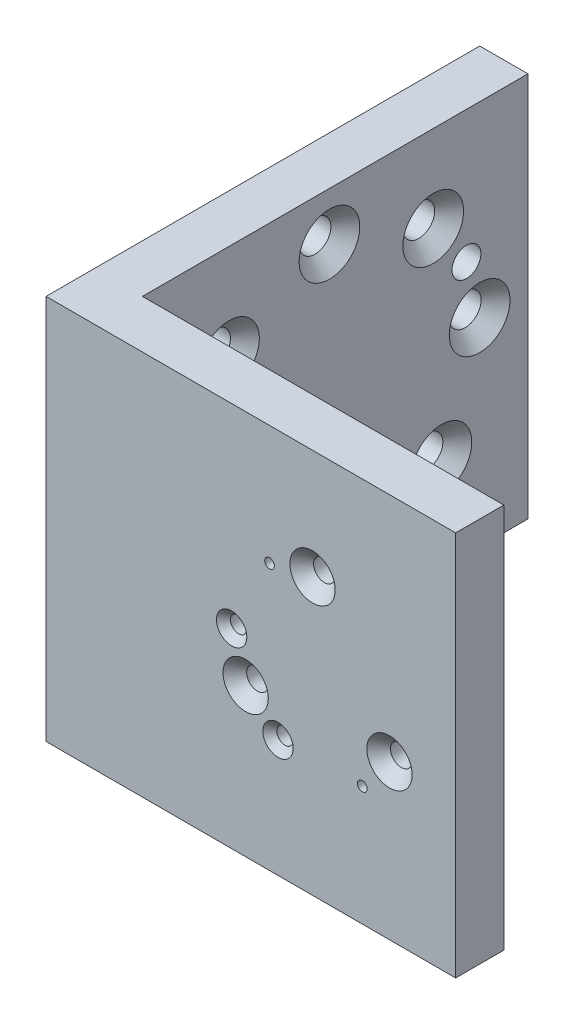
ISO-10303-21;
HEADER;
FILE_DESCRIPTION(('STEP AP214'),'2;1');
FILE_NAME('part.step','',(''),(''),'','','');
FILE_SCHEMA(('AUTOMOTIVE_DESIGN { 1 0 10303 214 1 1 1 1 }'));
ENDSEC;
DATA;
#1=APPLICATION_CONTEXT('core data for automotive mechanical design processes');
#2=APPLICATION_PROTOCOL_DEFINITION('international standard','automotive_design',2000,#1);
#3=PRODUCT_CONTEXT('',#1,'mechanical');
#4=PRODUCT('Part','Part','',(#3));
#5=PRODUCT_RELATED_PRODUCT_CATEGORY('part','',(#4));
#6=PRODUCT_DEFINITION_FORMATION('','',#4);
#7=PRODUCT_DEFINITION_CONTEXT('part definition',#1,'design');
#8=PRODUCT_DEFINITION('design','',#6,#7);
#9=PRODUCT_DEFINITION_SHAPE('','',#8);
#10=(LENGTH_UNIT() NAMED_UNIT(*) SI_UNIT(.MILLI.,.METRE.));
#11=(NAMED_UNIT(*) PLANE_ANGLE_UNIT() SI_UNIT($,.RADIAN.));
#12=(NAMED_UNIT(*) SI_UNIT($,.STERADIAN.) SOLID_ANGLE_UNIT());
#13=UNCERTAINTY_MEASURE_WITH_UNIT(LENGTH_MEASURE(1.E-05),#10,'distance_accuracy_value','');
#14=(GEOMETRIC_REPRESENTATION_CONTEXT(3) GLOBAL_UNCERTAINTY_ASSIGNED_CONTEXT((#13)) GLOBAL_UNIT_ASSIGNED_CONTEXT((#10,
#11,#12)) REPRESENTATION_CONTEXT('',''));
#15=CARTESIAN_POINT('',(0.,0.,0.));
#16=DIRECTION('',(0.,0.,1.));
#17=DIRECTION('',(1.,0.,0.));
#18=AXIS2_PLACEMENT_3D('',#15,#16,#17);
#19=CARTESIAN_POINT('',(0.,80.,90.));
#20=DIRECTION('',(-1.,0.,0.));
#21=DIRECTION('',(0.,0.,1.));
#22=AXIS2_PLACEMENT_3D('',#19,#20,#21);
#23=PLANE('',#22);
#24=CARTESIAN_POINT('',(0.,52.5731082601496,12.7618475538711));
#25=DIRECTION('',(-1.,0.,0.));
#26=DIRECTION('',(0.,0.,1.));
#27=AXIS2_PLACEMENT_3D('',#24,#25,#26);
#28=CIRCLE('',#27,3.0000000000041);
#29=CARTESIAN_POINT('',(0.,52.5731082601496,15.7618475538752));
#30=VERTEX_POINT('',#29);
#31=EDGE_CURVE('E153',#30,#30,#28,.T.);
#32=ORIENTED_EDGE('',*,*,#31,.F.);
#33=EDGE_LOOP('',(#32));
#34=FACE_BOUND('',#33,.T.);
#35=CARTESIAN_POINT('',(0.,27.4268917398504,67.2381524461289));
#36=DIRECTION('',(-1.,0.,0.));
#37=DIRECTION('',(0.,0.,1.));
#38=AXIS2_PLACEMENT_3D('',#35,#36,#37);
#39=CIRCLE('',#38,3.00000000000409);
#40=CARTESIAN_POINT('',(0.,27.4268917398504,70.238152446133));
#41=VERTEX_POINT('',#40);
#42=EDGE_CURVE('E152',#41,#41,#39,.T.);
#43=ORIENTED_EDGE('',*,*,#42,.F.);
#44=EDGE_LOOP('',(#43));
#45=FACE_BOUND('',#44,.T.);
#46=CARTESIAN_POINT('',(0.,10.0237082271074,38.8075522877674));
#47=DIRECTION('',(1.,0.,0.));
#48=DIRECTION('',(0.,0.,-1.));
#49=AXIS2_PLACEMENT_3D('',#46,#47,#48);
#50=CIRCLE('',#49,3.29999999999999);
#51=CARTESIAN_POINT('',(0.,10.0237082271074,35.5075522877674));
#52=VERTEX_POINT('',#51);
#53=EDGE_CURVE('E294',#52,#52,#50,.T.);
#54=ORIENTED_EDGE('',*,*,#53,.T.);
#55=EDGE_LOOP('',(#54));
#56=FACE_BOUND('',#55,.T.);
#57=CARTESIAN_POINT('',(0.,17.9603729490309,60.3532513239087));
#58=DIRECTION('',(1.,0.,0.));
#59=DIRECTION('',(0.,0.,-1.));
#60=AXIS2_PLACEMENT_3D('',#57,#58,#59);
#61=CIRCLE('',#60,3.29999999999999);
#62=CARTESIAN_POINT('',(0.,17.9603729490309,57.0532513239087));
#63=VERTEX_POINT('',#62);
#64=EDGE_CURVE('E297',#63,#63,#61,.T.);
#65=ORIENTED_EDGE('',*,*,#64,.T.);
#66=EDGE_LOOP('',(#65));
#67=FACE_BOUND('',#66,.T.);
#68=CARTESIAN_POINT('',(0.,38.8075522877674,69.9762917728927));
#69=DIRECTION('',(1.,0.,0.));
#70=DIRECTION('',(0.,0.,-1.));
#71=AXIS2_PLACEMENT_3D('',#68,#69,#70);
#72=CIRCLE('',#71,3.29999999999998);
#73=CARTESIAN_POINT('',(0.,38.8075522877674,66.6762917728927));
#74=VERTEX_POINT('',#73);
#75=EDGE_CURVE('E300',#74,#74,#72,.T.);
#76=ORIENTED_EDGE('',*,*,#75,.T.);
#77=EDGE_LOOP('',(#76));
#78=FACE_BOUND('',#77,.T.);
#79=CARTESIAN_POINT('',(0.,60.353251323909,62.0396270509689));
#80=DIRECTION('',(1.,0.,0.));
#81=DIRECTION('',(0.,0.,-1.));
#82=AXIS2_PLACEMENT_3D('',#79,#80,#81);
#83=CIRCLE('',#82,3.29999999999999);
#84=CARTESIAN_POINT('',(0.,60.353251323909,58.7396270509689));
#85=VERTEX_POINT('',#84);
#86=EDGE_CURVE('E303',#85,#85,#83,.T.);
#87=ORIENTED_EDGE('',*,*,#86,.T.);
#88=EDGE_LOOP('',(#87));
#89=FACE_BOUND('',#88,.T.);
#90=CARTESIAN_POINT('',(0.,69.9762917728927,41.1924477122326));
#91=DIRECTION('',(1.,0.,0.));
#92=DIRECTION('',(0.,0.,-1.));
#93=AXIS2_PLACEMENT_3D('',#90,#91,#92);
#94=CIRCLE('',#93,3.29999999999998);
#95=CARTESIAN_POINT('',(0.,69.9762917728927,37.8924477122326));
#96=VERTEX_POINT('',#95);
#97=EDGE_CURVE('E306',#96,#96,#94,.T.);
#98=ORIENTED_EDGE('',*,*,#97,.T.);
#99=EDGE_LOOP('',(#98));
#100=FACE_BOUND('',#99,.T.);
#101=DIRECTION('',(0.,0.,-1.));
#102=VECTOR('',#101,1.);
#103=CARTESIAN_POINT('',(0.,0.,90.));
#104=LINE('',#103,#102);
#105=CARTESIAN_POINT('',(0.,0.,90.));
#106=VERTEX_POINT('',#105);
#107=CARTESIAN_POINT('',(0.,0.,0.));
#108=VERTEX_POINT('',#107);
#109=EDGE_CURVE('E126',#106,#108,#104,.T.);
#110=ORIENTED_EDGE('',*,*,#109,.F.);
#111=DIRECTION('',(0.,-1.,0.));
#112=VECTOR('',#111,1.);
#113=CARTESIAN_POINT('',(0.,80.,90.));
#114=LINE('',#113,#112);
#115=CARTESIAN_POINT('',(0.,80.,90.));
#116=VERTEX_POINT('',#115);
#117=EDGE_CURVE('E60',#116,#106,#114,.T.);
#118=ORIENTED_EDGE('',*,*,#117,.F.);
#119=DIRECTION('',(0.,0.,-1.));
#120=VECTOR('',#119,1.);
#121=CARTESIAN_POINT('',(0.,80.,90.));
#122=LINE('',#121,#120);
#123=CARTESIAN_POINT('',(0.,80.,0.));
#124=VERTEX_POINT('',#123);
#125=EDGE_CURVE('E128',#116,#124,#122,.T.);
#126=ORIENTED_EDGE('',*,*,#125,.T.);
#127=DIRECTION('',(0.,-1.,0.));
#128=VECTOR('',#127,1.);
#129=CARTESIAN_POINT('',(0.,80.,0.));
#130=LINE('',#129,#128);
#131=EDGE_CURVE('E81',#124,#108,#130,.T.);
#132=ORIENTED_EDGE('',*,*,#131,.T.);
#133=EDGE_LOOP('',(#110,#118,#126,#132));
#134=FACE_BOUND('',#133,.T.);
#135=CARTESIAN_POINT('',(0.,19.6467486760911,17.9603729490311));
#136=DIRECTION('',(1.,0.,0.));
#137=DIRECTION('',(0.,0.,-1.));
#138=AXIS2_PLACEMENT_3D('',#135,#136,#137);
#139=CIRCLE('',#138,3.29999999999999);
#140=CARTESIAN_POINT('',(0.,19.6467486760911,14.6603729490311));
#141=VERTEX_POINT('',#140);
#142=EDGE_CURVE('E120',#141,#141,#139,.T.);
#143=ORIENTED_EDGE('',*,*,#142,.T.);
#144=EDGE_LOOP('',(#143));
#145=FACE_BOUND('',#144,.T.);
#146=CARTESIAN_POINT('',(0.,41.1924477122326,10.0237082271074));
#147=DIRECTION('',(1.,0.,0.));
#148=DIRECTION('',(0.,0.,-1.));
#149=AXIS2_PLACEMENT_3D('',#146,#147,#148);
#150=CIRCLE('',#149,3.29999999999998);
#151=CARTESIAN_POINT('',(0.,41.1924477122326,6.72370822710742));
#152=VERTEX_POINT('',#151);
#153=EDGE_CURVE('E311',#152,#152,#150,.T.);
#154=ORIENTED_EDGE('',*,*,#153,.T.);
#155=EDGE_LOOP('',(#154));
#156=FACE_BOUND('',#155,.T.);
#157=CARTESIAN_POINT('',(0.,62.0396270509691,19.6467486760913));
#158=DIRECTION('',(1.,0.,0.));
#159=DIRECTION('',(0.,0.,-1.));
#160=AXIS2_PLACEMENT_3D('',#157,#158,#159);
#161=CIRCLE('',#160,3.29999999999999);
#162=CARTESIAN_POINT('',(0.,62.0396270509691,16.3467486760913));
#163=VERTEX_POINT('',#162);
#164=EDGE_CURVE('E309',#163,#163,#161,.T.);
#165=ORIENTED_EDGE('',*,*,#164,.T.);
#166=EDGE_LOOP('',(#165));
#167=FACE_BOUND('',#166,.T.);
#168=ADVANCED_FACE('F36',(#34,#45,#56,#67,#78,#89,#100,#134,#145,#156,#167),#23,.T.);
#169=CARTESIAN_POINT('',(10.,0.,0.));
#170=DIRECTION('',(-1.,0.,0.));
#171=DIRECTION('',(0.,0.,1.));
#172=AXIS2_PLACEMENT_3D('',#169,#170,#171);
#173=PLANE('',#172);
#174=CARTESIAN_POINT('',(10.,19.6467486760911,17.9603729490311));
#175=DIRECTION('',(-1.,0.,0.));
#176=DIRECTION('',(0.,0.,1.));
#177=AXIS2_PLACEMENT_3D('',#174,#175,#176);
#178=CIRCLE('',#177,6.29999999998704);
#179=CARTESIAN_POINT('',(10.,19.6467486760911,24.2603729490181));
#180=VERTEX_POINT('',#179);
#181=EDGE_CURVE('E193',#180,#180,#178,.T.);
#182=ORIENTED_EDGE('',*,*,#181,.T.);
#183=EDGE_LOOP('',(#182));
#184=FACE_BOUND('',#183,.T.);
#185=CARTESIAN_POINT('',(10.,17.9603729490309,60.3532513239087));
#186=DIRECTION('',(-1.,0.,0.));
#187=DIRECTION('',(0.,0.,1.));
#188=AXIS2_PLACEMENT_3D('',#185,#186,#187);
#189=CIRCLE('',#188,6.29999999998704);
#190=CARTESIAN_POINT('',(10.,17.9603729490309,66.6532513238957));
#191=VERTEX_POINT('',#190);
#192=EDGE_CURVE('E190',#191,#191,#189,.T.);
#193=ORIENTED_EDGE('',*,*,#192,.T.);
#194=EDGE_LOOP('',(#193));
#195=FACE_BOUND('',#194,.T.);
#196=CARTESIAN_POINT('',(10.,10.0237082271074,38.8075522877674));
#197=DIRECTION('',(-1.,0.,0.));
#198=DIRECTION('',(0.,0.,1.));
#199=AXIS2_PLACEMENT_3D('',#196,#197,#198);
#200=CIRCLE('',#199,6.299999999987);
#201=CARTESIAN_POINT('',(10.,10.0237082271074,45.1075522877544));
#202=VERTEX_POINT('',#201);
#203=EDGE_CURVE('E187',#202,#202,#200,.T.);
#204=ORIENTED_EDGE('',*,*,#203,.T.);
#205=EDGE_LOOP('',(#204));
#206=FACE_BOUND('',#205,.T.);
#207=CARTESIAN_POINT('',(10.,38.8075522877674,69.9762917728927));
#208=DIRECTION('',(-1.,0.,0.));
#209=DIRECTION('',(0.,0.,1.));
#210=AXIS2_PLACEMENT_3D('',#207,#208,#209);
#211=CIRCLE('',#210,6.29999999998704);
#212=CARTESIAN_POINT('',(10.,38.8075522877674,76.2762917728797));
#213=VERTEX_POINT('',#212);
#214=EDGE_CURVE('E184',#213,#213,#211,.T.);
#215=ORIENTED_EDGE('',*,*,#214,.T.);
#216=EDGE_LOOP('',(#215));
#217=FACE_BOUND('',#216,.T.);
#218=CARTESIAN_POINT('',(10.,60.353251323909,62.0396270509689));
#219=DIRECTION('',(-1.,0.,0.));
#220=DIRECTION('',(0.,0.,1.));
#221=AXIS2_PLACEMENT_3D('',#218,#219,#220);
#222=CIRCLE('',#221,6.29999999998703);
#223=CARTESIAN_POINT('',(10.,60.353251323909,68.3396270509559));
#224=VERTEX_POINT('',#223);
#225=EDGE_CURVE('E181',#224,#224,#222,.T.);
#226=ORIENTED_EDGE('',*,*,#225,.T.);
#227=EDGE_LOOP('',(#226));
#228=FACE_BOUND('',#227,.T.);
#229=CARTESIAN_POINT('',(10.,69.9762917728927,41.1924477122326));
#230=DIRECTION('',(-1.,0.,0.));
#231=DIRECTION('',(0.,0.,1.));
#232=AXIS2_PLACEMENT_3D('',#229,#230,#231);
#233=CIRCLE('',#232,6.29999999998704);
#234=CARTESIAN_POINT('',(10.,69.9762917728927,47.4924477122196));
#235=VERTEX_POINT('',#234);
#236=EDGE_CURVE('E178',#235,#235,#233,.T.);
#237=ORIENTED_EDGE('',*,*,#236,.T.);
#238=EDGE_LOOP('',(#237));
#239=FACE_BOUND('',#238,.T.);
#240=CARTESIAN_POINT('',(10.,62.0396270509691,19.6467486760913));
#241=DIRECTION('',(-1.,0.,0.));
#242=DIRECTION('',(0.,0.,1.));
#243=AXIS2_PLACEMENT_3D('',#240,#241,#242);
#244=CIRCLE('',#243,6.299999999987);
#245=CARTESIAN_POINT('',(10.,62.0396270509691,25.9467486760783));
#246=VERTEX_POINT('',#245);
#247=EDGE_CURVE('E175',#246,#246,#244,.T.);
#248=ORIENTED_EDGE('',*,*,#247,.T.);
#249=EDGE_LOOP('',(#248));
#250=FACE_BOUND('',#249,.T.);
#251=CARTESIAN_POINT('',(10.,41.1924477122326,10.0237082271074));
#252=DIRECTION('',(-1.,0.,0.));
#253=DIRECTION('',(0.,0.,1.));
#254=AXIS2_PLACEMENT_3D('',#251,#252,#253);
#255=CIRCLE('',#254,6.29999999998704);
#256=CARTESIAN_POINT('',(10.,41.1924477122326,16.3237082270944));
#257=VERTEX_POINT('',#256);
#258=EDGE_CURVE('E172',#257,#257,#255,.T.);
#259=ORIENTED_EDGE('',*,*,#258,.T.);
#260=EDGE_LOOP('',(#259));
#261=FACE_BOUND('',#260,.T.);
#262=CARTESIAN_POINT('',(10.,52.5731082601496,12.7618475538711));
#263=DIRECTION('',(-1.,0.,0.));
#264=DIRECTION('',(0.,0.,1.));
#265=AXIS2_PLACEMENT_3D('',#262,#263,#264);
#266=CIRCLE('',#265,3.00000000000409);
#267=CARTESIAN_POINT('',(10.,52.5731082601496,15.7618475538752));
#268=VERTEX_POINT('',#267);
#269=EDGE_CURVE('E149',#268,#268,#266,.T.);
#270=ORIENTED_EDGE('',*,*,#269,.T.);
#271=EDGE_LOOP('',(#270));
#272=FACE_BOUND('',#271,.T.);
#273=CARTESIAN_POINT('',(10.,27.4268917398504,67.2381524461289));
#274=DIRECTION('',(-1.,0.,0.));
#275=DIRECTION('',(0.,0.,1.));
#276=AXIS2_PLACEMENT_3D('',#273,#274,#275);
#277=CIRCLE('',#276,3.00000000000409);
#278=CARTESIAN_POINT('',(10.,27.4268917398504,70.238152446133));
#279=VERTEX_POINT('',#278);
#280=EDGE_CURVE('E291',#279,#279,#277,.T.);
#281=ORIENTED_EDGE('',*,*,#280,.T.);
#282=EDGE_LOOP('',(#281));
#283=FACE_BOUND('',#282,.T.);
#284=DIRECTION('',(0.,0.,1.));
#285=VECTOR('',#284,1.);
#286=CARTESIAN_POINT('',(10.,80.,0.));
#287=LINE('',#286,#285);
#288=CARTESIAN_POINT('',(10.,80.,0.));
#289=VERTEX_POINT('',#288);
#290=CARTESIAN_POINT('',(10.,80.,80.));
#291=VERTEX_POINT('',#290);
#292=EDGE_CURVE('E104',#289,#291,#287,.T.);
#293=ORIENTED_EDGE('',*,*,#292,.T.);
#294=DIRECTION('',(0.,1.,0.));
#295=VECTOR('',#294,1.);
#296=CARTESIAN_POINT('',(10.,0.,80.));
#297=LINE('',#296,#295);
#298=CARTESIAN_POINT('',(10.,0.,80.));
#299=VERTEX_POINT('',#298);
#300=EDGE_CURVE('E98',#299,#291,#297,.T.);
#301=ORIENTED_EDGE('',*,*,#300,.F.);
#302=DIRECTION('',(0.,0.,1.));
#303=VECTOR('',#302,1.);
#304=CARTESIAN_POINT('',(10.,0.,0.));
#305=LINE('',#304,#303);
#306=CARTESIAN_POINT('',(10.,0.,0.));
#307=VERTEX_POINT('',#306);
#308=EDGE_CURVE('E101',#307,#299,#305,.T.);
#309=ORIENTED_EDGE('',*,*,#308,.F.);
#310=DIRECTION('',(0.,1.,0.));
#311=VECTOR('',#310,1.);
#312=CARTESIAN_POINT('',(10.,0.,0.));
#313=LINE('',#312,#311);
#314=EDGE_CURVE('E124',#307,#289,#313,.T.);
#315=ORIENTED_EDGE('',*,*,#314,.T.);
#316=EDGE_LOOP('',(#293,#301,#309,#315));
#317=FACE_BOUND('',#316,.T.);
#318=ADVANCED_FACE('F99',(#184,#195,#206,#217,#228,#239,#250,#261,#272,#283,#317),#173,.F.);
#319=CARTESIAN_POINT('',(85.,80.,90.));
#320=DIRECTION('',(0.,0.,1.));
#321=DIRECTION('',(1.,0.,0.));
#322=AXIS2_PLACEMENT_3D('',#319,#320,#321);
#323=PLANE('',#322);
#324=CARTESIAN_POINT('',(38.512017179999,39.5871357519102,90.));
#325=DIRECTION('',(0.,0.,1.));
#326=DIRECTION('',(1.,0.,0.));
#327=AXIS2_PLACEMENT_3D('',#324,#325,#326);
#328=CIRCLE('',#327,3.15000000003422);
#329=CARTESIAN_POINT('',(41.6620171800332,39.5871357519102,90.));
#330=VERTEX_POINT('',#329);
#331=EDGE_CURVE('E44',#330,#330,#328,.F.);
#332=ORIENTED_EDGE('',*,*,#331,.T.);
#333=EDGE_LOOP('',(#332));
#334=FACE_BOUND('',#333,.T.);
#335=CARTESIAN_POINT('',(48.1346530094905,24.3751378656039,90.));
#336=DIRECTION('',(0.,0.,1.));
#337=DIRECTION('',(1.,0.,0.));
#338=AXIS2_PLACEMENT_3D('',#335,#336,#337);
#339=CIRCLE('',#338,3.15000000003423);
#340=CARTESIAN_POINT('',(51.2846530095247,24.3751378656039,90.));
#341=VERTEX_POINT('',#340);
#342=EDGE_CURVE('E238',#341,#341,#339,.F.);
#343=ORIENTED_EDGE('',*,*,#342,.T.);
#344=EDGE_LOOP('',(#343));
#345=FACE_BOUND('',#344,.T.);
#346=CARTESIAN_POINT('',(41.4218353589565,30.7783073300706,90.));
#347=DIRECTION('',(0.,0.,1.));
#348=DIRECTION('',(1.,0.,0.));
#349=AXIS2_PLACEMENT_3D('',#346,#347,#348);
#350=CIRCLE('',#349,4.70000000007102);
#351=CARTESIAN_POINT('',(46.1218353590275,30.7783073300706,90.));
#352=VERTEX_POINT('',#351);
#353=EDGE_CURVE('E226',#352,#352,#350,.F.);
#354=ORIENTED_EDGE('',*,*,#353,.T.);
#355=EDGE_LOOP('',(#354));
#356=FACE_BOUND('',#355,.T.);
#357=CARTESIAN_POINT('',(71.2753024385736,31.9857854152686,90.));
#358=DIRECTION('',(0.,0.,1.));
#359=DIRECTION('',(1.,0.,0.));
#360=AXIS2_PLACEMENT_3D('',#357,#358,#359);
#361=CIRCLE('',#360,4.70000000007098);
#362=CARTESIAN_POINT('',(75.9753024386446,31.9857854152686,90.));
#363=VERTEX_POINT('',#362);
#364=EDGE_CURVE('E223',#363,#363,#361,.F.);
#365=ORIENTED_EDGE('',*,*,#364,.T.);
#366=EDGE_LOOP('',(#365));
#367=FACE_BOUND('',#366,.T.);
#368=CARTESIAN_POINT('',(55.3028622024699,57.2359072546608,90.));
#369=DIRECTION('',(0.,0.,1.));
#370=DIRECTION('',(1.,0.,0.));
#371=AXIS2_PLACEMENT_3D('',#368,#369,#370);
#372=CIRCLE('',#371,4.70000000007102);
#373=CARTESIAN_POINT('',(60.0028622025409,57.2359072546608,90.));
#374=VERTEX_POINT('',#373);
#375=EDGE_CURVE('E220',#374,#374,#372,.F.);
#376=ORIENTED_EDGE('',*,*,#375,.T.);
#377=EDGE_LOOP('',(#376));
#378=FACE_BOUND('',#377,.T.);
#379=CARTESIAN_POINT('',(46.3773641705084,55.2119978863063,90.));
#380=DIRECTION('',(0.,0.,-1.));
#381=DIRECTION('',(-1.,0.,0.));
#382=AXIS2_PLACEMENT_3D('',#379,#380,#381);
#383=CIRCLE('',#382,0.999999999999987);
#384=CARTESIAN_POINT('',(45.3773641705084,55.2119978863063,90.));
#385=VERTEX_POINT('',#384);
#386=EDGE_CURVE('E279',#385,#385,#383,.T.);
#387=ORIENTED_EDGE('',*,*,#386,.T.);
#388=EDGE_LOOP('',(#387));
#389=FACE_BOUND('',#388,.T.);
#390=CARTESIAN_POINT('',(65.6226358294915,24.7880021136938,90.));
#391=DIRECTION('',(0.,0.,-1.));
#392=DIRECTION('',(-1.,0.,0.));
#393=AXIS2_PLACEMENT_3D('',#390,#391,#392);
#394=CIRCLE('',#393,0.999999999999987);
#395=CARTESIAN_POINT('',(64.6226358294915,24.7880021136938,90.));
#396=VERTEX_POINT('',#395);
#397=EDGE_CURVE('E278',#396,#396,#394,.T.);
#398=ORIENTED_EDGE('',*,*,#397,.T.);
#399=EDGE_LOOP('',(#398));
#400=FACE_BOUND('',#399,.T.);
#401=DIRECTION('',(-1.,0.,0.));
#402=VECTOR('',#401,1.);
#403=CARTESIAN_POINT('',(85.,0.,90.));
#404=LINE('',#403,#402);
#405=CARTESIAN_POINT('',(85.,0.,90.));
#406=VERTEX_POINT('',#405);
#407=EDGE_CURVE('E131',#406,#106,#404,.T.);
#408=ORIENTED_EDGE('',*,*,#407,.F.);
#409=DIRECTION('',(0.,-1.,0.));
#410=VECTOR('',#409,1.);
#411=CARTESIAN_POINT('',(85.,80.,90.));
#412=LINE('',#411,#410);
#413=CARTESIAN_POINT('',(85.,80.,90.));
#414=VERTEX_POINT('',#413);
#415=EDGE_CURVE('E145',#414,#406,#412,.T.);
#416=ORIENTED_EDGE('',*,*,#415,.F.);
#417=DIRECTION('',(-1.,0.,0.));
#418=VECTOR('',#417,1.);
#419=CARTESIAN_POINT('',(85.,80.,90.));
#420=LINE('',#419,#418);
#421=EDGE_CURVE('E135',#414,#116,#420,.T.);
#422=ORIENTED_EDGE('',*,*,#421,.T.);
#423=ORIENTED_EDGE('',*,*,#117,.T.);
#424=EDGE_LOOP('',(#408,#416,#422,#423));
#425=FACE_BOUND('',#424,.T.);
#426=ADVANCED_FACE('F243',(#334,#345,#356,#367,#378,#389,#400,#425),#323,.T.);
#427=CARTESIAN_POINT('',(85.,80.,0.));
#428=DIRECTION('',(1.,0.,0.));
#429=DIRECTION('',(0.,0.,-1.));
#430=AXIS2_PLACEMENT_3D('',#427,#428,#429);
#431=PLANE('',#430);
#432=DIRECTION('',(0.,1.,0.));
#433=VECTOR('',#432,1.);
#434=CARTESIAN_POINT('',(85.,0.,80.));
#435=LINE('',#434,#433);
#436=CARTESIAN_POINT('',(85.,0.,80.));
#437=VERTEX_POINT('',#436);
#438=CARTESIAN_POINT('',(85.,80.,80.));
#439=VERTEX_POINT('',#438);
#440=EDGE_CURVE('E51',#437,#439,#435,.T.);
#441=ORIENTED_EDGE('',*,*,#440,.T.);
#442=DIRECTION('',(0.,0.,1.));
#443=VECTOR('',#442,1.);
#444=CARTESIAN_POINT('',(85.,80.,0.));
#445=LINE('',#444,#443);
#446=EDGE_CURVE('E133',#439,#414,#445,.T.);
#447=ORIENTED_EDGE('',*,*,#446,.T.);
#448=ORIENTED_EDGE('',*,*,#415,.T.);
#449=DIRECTION('',(0.,0.,1.));
#450=VECTOR('',#449,1.);
#451=CARTESIAN_POINT('',(85.,0.,0.));
#452=LINE('',#451,#450);
#453=EDGE_CURVE('E139',#437,#406,#452,.T.);
#454=ORIENTED_EDGE('',*,*,#453,.F.);
#455=EDGE_LOOP('',(#441,#447,#448,#454));
#456=FACE_BOUND('',#455,.T.);
#457=ADVANCED_FACE('F558',(#456),#431,.T.);
#458=CARTESIAN_POINT('',(0.,80.,0.));
#459=DIRECTION('',(0.,0.,-1.));
#460=DIRECTION('',(-1.,0.,0.));
#461=AXIS2_PLACEMENT_3D('',#458,#459,#460);
#462=PLANE('',#461);
#463=ORIENTED_EDGE('',*,*,#314,.F.);
#464=DIRECTION('',(1.,0.,0.));
#465=VECTOR('',#464,1.);
#466=CARTESIAN_POINT('',(0.,0.,0.));
#467=LINE('',#466,#465);
#468=EDGE_CURVE('E115',#108,#307,#467,.T.);
#469=ORIENTED_EDGE('',*,*,#468,.F.);
#470=ORIENTED_EDGE('',*,*,#131,.F.);
#471=DIRECTION('',(1.,0.,0.));
#472=VECTOR('',#471,1.);
#473=CARTESIAN_POINT('',(0.,80.,0.));
#474=LINE('',#473,#472);
#475=EDGE_CURVE('E130',#124,#289,#474,.T.);
#476=ORIENTED_EDGE('',*,*,#475,.T.);
#477=EDGE_LOOP('',(#463,#469,#470,#476));
#478=FACE_BOUND('',#477,.T.);
#479=ADVANCED_FACE('F341',(#478),#462,.T.);
#480=CARTESIAN_POINT('',(0.,80.,0.));
#481=DIRECTION('',(0.,-1.,0.));
#482=DIRECTION('',(0.,0.,-1.));
#483=AXIS2_PLACEMENT_3D('',#480,#481,#482);
#484=PLANE('',#483);
#485=DIRECTION('',(1.,0.,0.));
#486=VECTOR('',#485,1.);
#487=CARTESIAN_POINT('',(10.,80.,80.));
#488=LINE('',#487,#486);
#489=EDGE_CURVE('E116',#291,#439,#488,.T.);
#490=ORIENTED_EDGE('',*,*,#489,.F.);
#491=ORIENTED_EDGE('',*,*,#292,.F.);
#492=ORIENTED_EDGE('',*,*,#475,.F.);
#493=ORIENTED_EDGE('',*,*,#125,.F.);
#494=ORIENTED_EDGE('',*,*,#421,.F.);
#495=ORIENTED_EDGE('',*,*,#446,.F.);
#496=EDGE_LOOP('',(#490,#491,#492,#493,#494,#495));
#497=FACE_BOUND('',#496,.T.);
#498=ADVANCED_FACE('F540',(#497),#484,.F.);
#499=CARTESIAN_POINT('',(0.,0.,0.));
#500=DIRECTION('',(0.,-1.,0.));
#501=DIRECTION('',(0.,0.,-1.));
#502=AXIS2_PLACEMENT_3D('',#499,#500,#501);
#503=PLANE('',#502);
#504=ORIENTED_EDGE('',*,*,#308,.T.);
#505=DIRECTION('',(1.,0.,0.));
#506=VECTOR('',#505,1.);
#507=CARTESIAN_POINT('',(10.,0.,80.));
#508=LINE('',#507,#506);
#509=EDGE_CURVE('E106',#299,#437,#508,.T.);
#510=ORIENTED_EDGE('',*,*,#509,.T.);
#511=ORIENTED_EDGE('',*,*,#453,.T.);
#512=ORIENTED_EDGE('',*,*,#407,.T.);
#513=ORIENTED_EDGE('',*,*,#109,.T.);
#514=ORIENTED_EDGE('',*,*,#468,.T.);
#515=EDGE_LOOP('',(#504,#510,#511,#512,#513,#514));
#516=FACE_BOUND('',#515,.T.);
#517=ADVANCED_FACE('F113',(#516),#503,.T.);
#518=CARTESIAN_POINT('',(10.,0.,80.));
#519=DIRECTION('',(0.,0.,1.));
#520=DIRECTION('',(1.,0.,0.));
#521=AXIS2_PLACEMENT_3D('',#518,#519,#520);
#522=PLANE('',#521);
#523=CARTESIAN_POINT('',(48.1346530094905,24.3751378656039,80.));
#524=DIRECTION('',(0.,0.,1.));
#525=DIRECTION('',(1.,0.,0.));
#526=AXIS2_PLACEMENT_3D('',#523,#524,#525);
#527=CIRCLE('',#526,1.69999999999998);
#528=CARTESIAN_POINT('',(49.8346530094905,24.3751378656039,80.));
#529=VERTEX_POINT('',#528);
#530=EDGE_CURVE('E167',#529,#529,#527,.T.);
#531=ORIENTED_EDGE('',*,*,#530,.T.);
#532=EDGE_LOOP('',(#531));
#533=FACE_BOUND('',#532,.T.);
#534=CARTESIAN_POINT('',(38.512017179999,39.5871357519102,80.));
#535=DIRECTION('',(0.,0.,1.));
#536=DIRECTION('',(1.,0.,0.));
#537=AXIS2_PLACEMENT_3D('',#534,#535,#536);
#538=CIRCLE('',#537,1.69999999999998);
#539=CARTESIAN_POINT('',(40.212017179999,39.5871357519102,80.));
#540=VERTEX_POINT('',#539);
#541=EDGE_CURVE('E164',#540,#540,#538,.T.);
#542=ORIENTED_EDGE('',*,*,#541,.T.);
#543=EDGE_LOOP('',(#542));
#544=FACE_BOUND('',#543,.T.);
#545=CARTESIAN_POINT('',(71.2753024385736,31.9857854152686,80.));
#546=DIRECTION('',(0.,0.,1.));
#547=DIRECTION('',(1.,0.,0.));
#548=AXIS2_PLACEMENT_3D('',#545,#546,#547);
#549=CIRCLE('',#548,2.24999999999998);
#550=CARTESIAN_POINT('',(73.5253024385736,31.9857854152686,80.));
#551=VERTEX_POINT('',#550);
#552=EDGE_CURVE('E161',#551,#551,#549,.T.);
#553=ORIENTED_EDGE('',*,*,#552,.T.);
#554=EDGE_LOOP('',(#553));
#555=FACE_BOUND('',#554,.T.);
#556=CARTESIAN_POINT('',(41.4218353589565,30.7783073300706,80.));
#557=DIRECTION('',(0.,0.,1.));
#558=DIRECTION('',(1.,0.,0.));
#559=AXIS2_PLACEMENT_3D('',#556,#557,#558);
#560=CIRCLE('',#559,2.24999999999998);
#561=CARTESIAN_POINT('',(43.6718353589565,30.7783073300706,80.));
#562=VERTEX_POINT('',#561);
#563=EDGE_CURVE('E158',#562,#562,#560,.T.);
#564=ORIENTED_EDGE('',*,*,#563,.T.);
#565=EDGE_LOOP('',(#564));
#566=FACE_BOUND('',#565,.T.);
#567=CARTESIAN_POINT('',(55.3028622024699,57.2359072546608,80.));
#568=DIRECTION('',(0.,0.,1.));
#569=DIRECTION('',(1.,0.,0.));
#570=AXIS2_PLACEMENT_3D('',#567,#568,#569);
#571=CIRCLE('',#570,2.24999999999998);
#572=CARTESIAN_POINT('',(57.5528622024699,57.2359072546608,80.));
#573=VERTEX_POINT('',#572);
#574=EDGE_CURVE('E154',#573,#573,#571,.T.);
#575=ORIENTED_EDGE('',*,*,#574,.T.);
#576=EDGE_LOOP('',(#575));
#577=FACE_BOUND('',#576,.T.);
#578=CARTESIAN_POINT('',(46.3773641705084,55.2119978863063,80.));
#579=DIRECTION('',(0.,0.,-1.));
#580=DIRECTION('',(-1.,0.,0.));
#581=AXIS2_PLACEMENT_3D('',#578,#579,#580);
#582=CIRCLE('',#581,0.999999999999987);
#583=CARTESIAN_POINT('',(45.3773641705084,55.2119978863063,80.));
#584=VERTEX_POINT('',#583);
#585=EDGE_CURVE('E157',#584,#584,#582,.T.);
#586=ORIENTED_EDGE('',*,*,#585,.F.);
#587=EDGE_LOOP('',(#586));
#588=FACE_BOUND('',#587,.T.);
#589=CARTESIAN_POINT('',(65.6226358294915,24.7880021136938,80.));
#590=DIRECTION('',(0.,0.,-1.));
#591=DIRECTION('',(-1.,0.,0.));
#592=AXIS2_PLACEMENT_3D('',#589,#590,#591);
#593=CIRCLE('',#592,0.999999999999987);
#594=CARTESIAN_POINT('',(64.6226358294915,24.7880021136938,80.));
#595=VERTEX_POINT('',#594);
#596=EDGE_CURVE('E276',#595,#595,#593,.T.);
#597=ORIENTED_EDGE('',*,*,#596,.F.);
#598=EDGE_LOOP('',(#597));
#599=FACE_BOUND('',#598,.T.);
#600=ORIENTED_EDGE('',*,*,#489,.T.);
#601=ORIENTED_EDGE('',*,*,#440,.F.);
#602=ORIENTED_EDGE('',*,*,#509,.F.);
#603=ORIENTED_EDGE('',*,*,#300,.T.);
#604=EDGE_LOOP('',(#600,#601,#602,#603));
#605=FACE_BOUND('',#604,.T.);
#606=ADVANCED_FACE('F108',(#533,#544,#555,#566,#577,#588,#599,#605),#522,.F.);
#607=CARTESIAN_POINT('',(10.,19.6467486760911,17.9603729490311));
#608=DIRECTION('',(1.,0.,0.));
#609=DIRECTION('',(0.,0.,-1.));
#610=AXIS2_PLACEMENT_3D('',#607,#608,#609);
#611=CYLINDRICAL_SURFACE('',#610,3.29999999999999);
#612=CARTESIAN_POINT('',(6.99999999995612,19.6467486760911,17.9603729490311));
#613=DIRECTION('',(-1.,0.,0.));
#614=DIRECTION('',(0.,0.,1.));
#615=AXIS2_PLACEMENT_3D('',#612,#613,#614);
#616=CIRCLE('',#615,3.29999999999999);
#617=CARTESIAN_POINT('',(6.99999999995612,19.6467486760911,21.2603729490311));
#618=VERTEX_POINT('',#617);
#619=EDGE_CURVE('E144',#618,#618,#616,.F.);
#620=ORIENTED_EDGE('',*,*,#619,.T.);
#621=EDGE_LOOP('',(#620));
#622=FACE_BOUND('',#621,.T.);
#623=ORIENTED_EDGE('',*,*,#142,.F.);
#624=EDGE_LOOP('',(#623));
#625=FACE_BOUND('',#624,.T.);
#626=ADVANCED_FACE('F262',(#622,#625),#611,.F.);
#627=CARTESIAN_POINT('',(10.,41.1924477122326,10.0237082271074));
#628=DIRECTION('',(1.,0.,0.));
#629=DIRECTION('',(0.,0.,-1.));
#630=AXIS2_PLACEMENT_3D('',#627,#628,#629);
#631=CYLINDRICAL_SURFACE('',#630,3.29999999999998);
#632=CARTESIAN_POINT('',(6.99999999995612,41.1924477122326,10.0237082271074));
#633=DIRECTION('',(-1.,0.,0.));
#634=DIRECTION('',(0.,0.,1.));
#635=AXIS2_PLACEMENT_3D('',#632,#633,#634);
#636=CIRCLE('',#635,3.29999999999998);
#637=CARTESIAN_POINT('',(6.99999999995612,41.1924477122326,13.3237082271074));
#638=VERTEX_POINT('',#637);
#639=EDGE_CURVE('E214',#638,#638,#636,.F.);
#640=ORIENTED_EDGE('',*,*,#639,.T.);
#641=EDGE_LOOP('',(#640));
#642=FACE_BOUND('',#641,.T.);
#643=ORIENTED_EDGE('',*,*,#153,.F.);
#644=EDGE_LOOP('',(#643));
#645=FACE_BOUND('',#644,.T.);
#646=ADVANCED_FACE('F320',(#642,#645),#631,.F.);
#647=CARTESIAN_POINT('',(10.,62.0396270509691,19.6467486760913));
#648=DIRECTION('',(1.,0.,0.));
#649=DIRECTION('',(0.,0.,-1.));
#650=AXIS2_PLACEMENT_3D('',#647,#648,#649);
#651=CYLINDRICAL_SURFACE('',#650,3.29999999999999);
#652=CARTESIAN_POINT('',(6.99999999995615,62.0396270509691,19.6467486760913));
#653=DIRECTION('',(-1.,0.,0.));
#654=DIRECTION('',(0.,0.,1.));
#655=AXIS2_PLACEMENT_3D('',#652,#653,#654);
#656=CIRCLE('',#655,3.29999999999999);
#657=CARTESIAN_POINT('',(6.99999999995615,62.0396270509691,22.9467486760913));
#658=VERTEX_POINT('',#657);
#659=EDGE_CURVE('E211',#658,#658,#656,.F.);
#660=ORIENTED_EDGE('',*,*,#659,.T.);
#661=EDGE_LOOP('',(#660));
#662=FACE_BOUND('',#661,.T.);
#663=ORIENTED_EDGE('',*,*,#164,.F.);
#664=EDGE_LOOP('',(#663));
#665=FACE_BOUND('',#664,.T.);
#666=ADVANCED_FACE('F326',(#662,#665),#651,.F.);
#667=CARTESIAN_POINT('',(10.,69.9762917728927,41.1924477122326));
#668=DIRECTION('',(1.,0.,0.));
#669=DIRECTION('',(0.,0.,-1.));
#670=AXIS2_PLACEMENT_3D('',#667,#668,#669);
#671=CYLINDRICAL_SURFACE('',#670,3.29999999999998);
#672=CARTESIAN_POINT('',(6.99999999995612,69.9762917728927,41.1924477122326));
#673=DIRECTION('',(-1.,0.,0.));
#674=DIRECTION('',(0.,0.,1.));
#675=AXIS2_PLACEMENT_3D('',#672,#673,#674);
#676=CIRCLE('',#675,3.29999999999998);
#677=CARTESIAN_POINT('',(6.99999999995612,69.9762917728927,44.4924477122326));
#678=VERTEX_POINT('',#677);
#679=EDGE_CURVE('E208',#678,#678,#676,.F.);
#680=ORIENTED_EDGE('',*,*,#679,.T.);
#681=EDGE_LOOP('',(#680));
#682=FACE_BOUND('',#681,.T.);
#683=ORIENTED_EDGE('',*,*,#97,.F.);
#684=EDGE_LOOP('',(#683));
#685=FACE_BOUND('',#684,.T.);
#686=ADVANCED_FACE('F434',(#682,#685),#671,.F.);
#687=CARTESIAN_POINT('',(10.,60.353251323909,62.0396270509689));
#688=DIRECTION('',(1.,0.,0.));
#689=DIRECTION('',(0.,0.,-1.));
#690=AXIS2_PLACEMENT_3D('',#687,#688,#689);
#691=CYLINDRICAL_SURFACE('',#690,3.29999999999999);
#692=CARTESIAN_POINT('',(6.99999999995613,60.353251323909,62.0396270509689));
#693=DIRECTION('',(-1.,0.,0.));
#694=DIRECTION('',(0.,0.,1.));
#695=AXIS2_PLACEMENT_3D('',#692,#693,#694);
#696=CIRCLE('',#695,3.29999999999999);
#697=CARTESIAN_POINT('',(6.99999999995613,60.353251323909,65.3396270509689));
#698=VERTEX_POINT('',#697);
#699=EDGE_CURVE('E205',#698,#698,#696,.F.);
#700=ORIENTED_EDGE('',*,*,#699,.T.);
#701=EDGE_LOOP('',(#700));
#702=FACE_BOUND('',#701,.T.);
#703=ORIENTED_EDGE('',*,*,#86,.F.);
#704=EDGE_LOOP('',(#703));
#705=FACE_BOUND('',#704,.T.);
#706=ADVANCED_FACE('F430',(#702,#705),#691,.F.);
#707=CARTESIAN_POINT('',(10.,38.8075522877674,69.9762917728927));
#708=DIRECTION('',(1.,0.,0.));
#709=DIRECTION('',(0.,0.,-1.));
#710=AXIS2_PLACEMENT_3D('',#707,#708,#709);
#711=CYLINDRICAL_SURFACE('',#710,3.29999999999998);
#712=CARTESIAN_POINT('',(6.99999999995612,38.8075522877674,69.9762917728927));
#713=DIRECTION('',(-1.,0.,0.));
#714=DIRECTION('',(0.,0.,1.));
#715=AXIS2_PLACEMENT_3D('',#712,#713,#714);
#716=CIRCLE('',#715,3.29999999999998);
#717=CARTESIAN_POINT('',(6.99999999995612,38.8075522877674,73.2762917728927));
#718=VERTEX_POINT('',#717);
#719=EDGE_CURVE('E202',#718,#718,#716,.F.);
#720=ORIENTED_EDGE('',*,*,#719,.T.);
#721=EDGE_LOOP('',(#720));
#722=FACE_BOUND('',#721,.T.);
#723=ORIENTED_EDGE('',*,*,#75,.F.);
#724=EDGE_LOOP('',(#723));
#725=FACE_BOUND('',#724,.T.);
#726=ADVANCED_FACE('F426',(#722,#725),#711,.F.);
#727=CARTESIAN_POINT('',(10.,17.9603729490309,60.3532513239087));
#728=DIRECTION('',(1.,0.,0.));
#729=DIRECTION('',(0.,0.,-1.));
#730=AXIS2_PLACEMENT_3D('',#727,#728,#729);
#731=CYLINDRICAL_SURFACE('',#730,3.29999999999999);
#732=CARTESIAN_POINT('',(6.99999999995612,17.9603729490309,60.3532513239087));
#733=DIRECTION('',(-1.,0.,0.));
#734=DIRECTION('',(0.,0.,1.));
#735=AXIS2_PLACEMENT_3D('',#732,#733,#734);
#736=CIRCLE('',#735,3.29999999999999);
#737=CARTESIAN_POINT('',(6.99999999995612,17.9603729490309,63.6532513239087));
#738=VERTEX_POINT('',#737);
#739=EDGE_CURVE('E196',#738,#738,#736,.F.);
#740=ORIENTED_EDGE('',*,*,#739,.T.);
#741=EDGE_LOOP('',(#740));
#742=FACE_BOUND('',#741,.T.);
#743=ORIENTED_EDGE('',*,*,#64,.F.);
#744=EDGE_LOOP('',(#743));
#745=FACE_BOUND('',#744,.T.);
#746=ADVANCED_FACE('F422',(#742,#745),#731,.F.);
#747=CARTESIAN_POINT('',(10.,10.0237082271074,38.8075522877674));
#748=DIRECTION('',(1.,0.,0.));
#749=DIRECTION('',(0.,0.,-1.));
#750=AXIS2_PLACEMENT_3D('',#747,#748,#749);
#751=CYLINDRICAL_SURFACE('',#750,3.29999999999999);
#752=CARTESIAN_POINT('',(6.99999999995615,10.0237082271074,38.8075522877674));
#753=DIRECTION('',(-1.,0.,0.));
#754=DIRECTION('',(0.,0.,1.));
#755=AXIS2_PLACEMENT_3D('',#752,#753,#754);
#756=CIRCLE('',#755,3.29999999999999);
#757=CARTESIAN_POINT('',(6.99999999995615,10.0237082271074,42.1075522877674));
#758=VERTEX_POINT('',#757);
#759=EDGE_CURVE('E199',#758,#758,#756,.F.);
#760=ORIENTED_EDGE('',*,*,#759,.T.);
#761=EDGE_LOOP('',(#760));
#762=FACE_BOUND('',#761,.T.);
#763=ORIENTED_EDGE('',*,*,#53,.F.);
#764=EDGE_LOOP('',(#763));
#765=FACE_BOUND('',#764,.T.);
#766=ADVANCED_FACE('F418',(#762,#765),#751,.F.);
#767=CARTESIAN_POINT('',(0.,27.4268917398504,67.2381524461289));
#768=DIRECTION('',(-1.,0.,0.));
#769=DIRECTION('',(0.,0.,1.));
#770=AXIS2_PLACEMENT_3D('',#767,#768,#769);
#771=CYLINDRICAL_SURFACE('',#770,3.00000000000409);
#772=ORIENTED_EDGE('',*,*,#42,.T.);
#773=EDGE_LOOP('',(#772));
#774=FACE_BOUND('',#773,.T.);
#775=ORIENTED_EDGE('',*,*,#280,.F.);
#776=EDGE_LOOP('',(#775));
#777=FACE_BOUND('',#776,.T.);
#778=ADVANCED_FACE('F414',(#774,#777),#771,.F.);
#779=CARTESIAN_POINT('',(0.,52.5731082601496,12.7618475538711));
#780=DIRECTION('',(-1.,0.,0.));
#781=DIRECTION('',(0.,0.,1.));
#782=AXIS2_PLACEMENT_3D('',#779,#780,#781);
#783=CYLINDRICAL_SURFACE('',#782,3.00000000000409);
#784=ORIENTED_EDGE('',*,*,#31,.T.);
#785=EDGE_LOOP('',(#784));
#786=FACE_BOUND('',#785,.T.);
#787=ORIENTED_EDGE('',*,*,#269,.F.);
#788=EDGE_LOOP('',(#787));
#789=FACE_BOUND('',#788,.T.);
#790=ADVANCED_FACE('F410',(#786,#789),#783,.F.);
#791=CARTESIAN_POINT('',(65.6226358294915,24.7880021136938,80.));
#792=DIRECTION('',(0.,0.,-1.));
#793=DIRECTION('',(-1.,0.,0.));
#794=AXIS2_PLACEMENT_3D('',#791,#792,#793);
#795=CYLINDRICAL_SURFACE('',#794,0.999999999999987);
#796=ORIENTED_EDGE('',*,*,#397,.F.);
#797=EDGE_LOOP('',(#796));
#798=FACE_BOUND('',#797,.T.);
#799=ORIENTED_EDGE('',*,*,#596,.T.);
#800=EDGE_LOOP('',(#799));
#801=FACE_BOUND('',#800,.T.);
#802=ADVANCED_FACE('F403',(#798,#801),#795,.F.);
#803=CARTESIAN_POINT('',(46.3773641705084,55.2119978863063,80.));
#804=DIRECTION('',(0.,0.,-1.));
#805=DIRECTION('',(-1.,0.,0.));
#806=AXIS2_PLACEMENT_3D('',#803,#804,#805);
#807=CYLINDRICAL_SURFACE('',#806,0.999999999999987);
#808=ORIENTED_EDGE('',*,*,#386,.F.);
#809=EDGE_LOOP('',(#808));
#810=FACE_BOUND('',#809,.T.);
#811=ORIENTED_EDGE('',*,*,#585,.T.);
#812=EDGE_LOOP('',(#811));
#813=FACE_BOUND('',#812,.T.);
#814=ADVANCED_FACE('F395',(#810,#813),#807,.F.);
#815=CARTESIAN_POINT('',(55.3028622024699,57.2359072546608,90.));
#816=DIRECTION('',(0.,0.,1.));
#817=DIRECTION('',(1.,0.,0.));
#818=AXIS2_PLACEMENT_3D('',#815,#816,#817);
#819=CYLINDRICAL_SURFACE('',#818,2.24999999999998);
#820=CARTESIAN_POINT('',(55.3028622024699,57.2359072546608,87.549999999929));
#821=DIRECTION('',(0.,0.,1.));
#822=DIRECTION('',(1.,0.,0.));
#823=AXIS2_PLACEMENT_3D('',#820,#821,#822);
#824=CIRCLE('',#823,2.24999999999998);
#825=CARTESIAN_POINT('',(57.5528622024699,57.2359072546608,87.549999999929));
#826=VERTEX_POINT('',#825);
#827=EDGE_CURVE('E232',#826,#826,#824,.T.);
#828=ORIENTED_EDGE('',*,*,#827,.T.);
#829=EDGE_LOOP('',(#828));
#830=FACE_BOUND('',#829,.T.);
#831=ORIENTED_EDGE('',*,*,#574,.F.);
#832=EDGE_LOOP('',(#831));
#833=FACE_BOUND('',#832,.T.);
#834=ADVANCED_FACE('F391',(#830,#833),#819,.F.);
#835=CARTESIAN_POINT('',(41.4218353589565,30.7783073300706,90.));
#836=DIRECTION('',(0.,0.,1.));
#837=DIRECTION('',(1.,0.,0.));
#838=AXIS2_PLACEMENT_3D('',#835,#836,#837);
#839=CYLINDRICAL_SURFACE('',#838,2.24999999999998);
#840=CARTESIAN_POINT('',(41.4218353589565,30.7783073300706,87.549999999929));
#841=DIRECTION('',(0.,0.,1.));
#842=DIRECTION('',(1.,0.,0.));
#843=AXIS2_PLACEMENT_3D('',#840,#841,#842);
#844=CIRCLE('',#843,2.24999999999998);
#845=CARTESIAN_POINT('',(43.6718353589565,30.7783073300706,87.549999999929));
#846=VERTEX_POINT('',#845);
#847=EDGE_CURVE('E217',#846,#846,#844,.T.);
#848=ORIENTED_EDGE('',*,*,#847,.T.);
#849=EDGE_LOOP('',(#848));
#850=FACE_BOUND('',#849,.T.);
#851=ORIENTED_EDGE('',*,*,#563,.F.);
#852=EDGE_LOOP('',(#851));
#853=FACE_BOUND('',#852,.T.);
#854=ADVANCED_FACE('F394',(#850,#853),#839,.F.);
#855=CARTESIAN_POINT('',(71.2753024385736,31.9857854152686,90.));
#856=DIRECTION('',(0.,0.,1.));
#857=DIRECTION('',(1.,0.,0.));
#858=AXIS2_PLACEMENT_3D('',#855,#856,#857);
#859=CYLINDRICAL_SURFACE('',#858,2.24999999999998);
#860=CARTESIAN_POINT('',(71.2753024385736,31.9857854152686,87.549999999929));
#861=DIRECTION('',(0.,0.,1.));
#862=DIRECTION('',(1.,0.,0.));
#863=AXIS2_PLACEMENT_3D('',#860,#861,#862);
#864=CIRCLE('',#863,2.24999999999998);
#865=CARTESIAN_POINT('',(73.5253024385736,31.9857854152686,87.549999999929));
#866=VERTEX_POINT('',#865);
#867=EDGE_CURVE('E229',#866,#866,#864,.T.);
#868=ORIENTED_EDGE('',*,*,#867,.T.);
#869=EDGE_LOOP('',(#868));
#870=FACE_BOUND('',#869,.T.);
#871=ORIENTED_EDGE('',*,*,#552,.F.);
#872=EDGE_LOOP('',(#871));
#873=FACE_BOUND('',#872,.T.);
#874=ADVANCED_FACE('F256',(#870,#873),#859,.F.);
#875=CARTESIAN_POINT('',(38.512017179999,39.5871357519102,90.));
#876=DIRECTION('',(0.,0.,1.));
#877=DIRECTION('',(1.,0.,0.));
#878=AXIS2_PLACEMENT_3D('',#875,#876,#877);
#879=CYLINDRICAL_SURFACE('',#878,1.69999999999998);
#880=CARTESIAN_POINT('',(38.512017179999,39.5871357519102,88.5499999999657));
#881=DIRECTION('',(0.,0.,1.));
#882=DIRECTION('',(1.,0.,0.));
#883=AXIS2_PLACEMENT_3D('',#880,#881,#882);
#884=CIRCLE('',#883,1.69999999999998);
#885=CARTESIAN_POINT('',(40.212017179999,39.5871357519102,88.5499999999657));
#886=VERTEX_POINT('',#885);
#887=EDGE_CURVE('E235',#886,#886,#884,.T.);
#888=ORIENTED_EDGE('',*,*,#887,.T.);
#889=EDGE_LOOP('',(#888));
#890=FACE_BOUND('',#889,.T.);
#891=ORIENTED_EDGE('',*,*,#541,.F.);
#892=EDGE_LOOP('',(#891));
#893=FACE_BOUND('',#892,.T.);
#894=ADVANCED_FACE('F252',(#890,#893),#879,.F.);
#895=CARTESIAN_POINT('',(48.1346530094905,24.3751378656039,90.));
#896=DIRECTION('',(0.,0.,1.));
#897=DIRECTION('',(1.,0.,0.));
#898=AXIS2_PLACEMENT_3D('',#895,#896,#897);
#899=CYLINDRICAL_SURFACE('',#898,1.69999999999998);
#900=CARTESIAN_POINT('',(48.1346530094905,24.3751378656039,88.5499999999657));
#901=DIRECTION('',(0.,0.,1.));
#902=DIRECTION('',(1.,0.,0.));
#903=AXIS2_PLACEMENT_3D('',#900,#901,#902);
#904=CIRCLE('',#903,1.69999999999998);
#905=CARTESIAN_POINT('',(49.8346530094905,24.3751378656039,88.5499999999657));
#906=VERTEX_POINT('',#905);
#907=EDGE_CURVE('E11',#906,#906,#904,.T.);
#908=ORIENTED_EDGE('',*,*,#907,.T.);
#909=EDGE_LOOP('',(#908));
#910=FACE_BOUND('',#909,.T.);
#911=ORIENTED_EDGE('',*,*,#530,.F.);
#912=EDGE_LOOP('',(#911));
#913=FACE_BOUND('',#912,.T.);
#914=ADVANCED_FACE('F255',(#910,#913),#899,.F.);
#915=CARTESIAN_POINT('',(6.99999999995612,19.6467486760911,17.9603729490311));
#916=DIRECTION('',(1.,0.,0.));
#917=DIRECTION('',(0.,0.,-1.));
#918=AXIS2_PLACEMENT_3D('',#915,#916,#917);
#919=CONICAL_SURFACE('',#918,3.29999999999999,0.785398163387977);
#920=ORIENTED_EDGE('',*,*,#181,.F.);
#921=EDGE_LOOP('',(#920));
#922=FACE_BOUND('',#921,.T.);
#923=ORIENTED_EDGE('',*,*,#619,.F.);
#924=EDGE_LOOP('',(#923));
#925=FACE_BOUND('',#924,.T.);
#926=ADVANCED_FACE('F343',(#922,#925),#919,.F.);
#927=CARTESIAN_POINT('',(6.99999999995612,17.9603729490309,60.3532513239087));
#928=DIRECTION('',(1.,0.,0.));
#929=DIRECTION('',(0.,0.,-1.));
#930=AXIS2_PLACEMENT_3D('',#927,#928,#929);
#931=CONICAL_SURFACE('',#930,3.29999999999999,0.785398163387977);
#932=ORIENTED_EDGE('',*,*,#192,.F.);
#933=EDGE_LOOP('',(#932));
#934=FACE_BOUND('',#933,.T.);
#935=ORIENTED_EDGE('',*,*,#739,.F.);
#936=EDGE_LOOP('',(#935));
#937=FACE_BOUND('',#936,.T.);
#938=ADVANCED_FACE('F346',(#934,#937),#931,.F.);
#939=CARTESIAN_POINT('',(6.99999999995615,10.0237082271074,38.8075522877674));
#940=DIRECTION('',(1.,0.,0.));
#941=DIRECTION('',(0.,0.,-1.));
#942=AXIS2_PLACEMENT_3D('',#939,#940,#941);
#943=CONICAL_SURFACE('',#942,3.29999999999999,0.785398163387975);
#944=ORIENTED_EDGE('',*,*,#203,.F.);
#945=EDGE_LOOP('',(#944));
#946=FACE_BOUND('',#945,.T.);
#947=ORIENTED_EDGE('',*,*,#759,.F.);
#948=EDGE_LOOP('',(#947));
#949=FACE_BOUND('',#948,.T.);
#950=ADVANCED_FACE('F350',(#946,#949),#943,.F.);
#951=CARTESIAN_POINT('',(6.99999999995612,38.8075522877674,69.9762917728927));
#952=DIRECTION('',(1.,0.,0.));
#953=DIRECTION('',(0.,0.,-1.));
#954=AXIS2_PLACEMENT_3D('',#951,#952,#953);
#955=CONICAL_SURFACE('',#954,3.29999999999998,0.785398163387977);
#956=ORIENTED_EDGE('',*,*,#214,.F.);
#957=EDGE_LOOP('',(#956));
#958=FACE_BOUND('',#957,.T.);
#959=ORIENTED_EDGE('',*,*,#719,.F.);
#960=EDGE_LOOP('',(#959));
#961=FACE_BOUND('',#960,.T.);
#962=ADVANCED_FACE('F354',(#958,#961),#955,.F.);
#963=CARTESIAN_POINT('',(6.99999999995613,60.353251323909,62.0396270509689));
#964=DIRECTION('',(1.,0.,0.));
#965=DIRECTION('',(0.,0.,-1.));
#966=AXIS2_PLACEMENT_3D('',#963,#964,#965);
#967=CONICAL_SURFACE('',#966,3.29999999999999,0.785398163387976);
#968=ORIENTED_EDGE('',*,*,#225,.F.);
#969=EDGE_LOOP('',(#968));
#970=FACE_BOUND('',#969,.T.);
#971=ORIENTED_EDGE('',*,*,#699,.F.);
#972=EDGE_LOOP('',(#971));
#973=FACE_BOUND('',#972,.T.);
#974=ADVANCED_FACE('F358',(#970,#973),#967,.F.);
#975=CARTESIAN_POINT('',(6.99999999995612,69.9762917728927,41.1924477122326));
#976=DIRECTION('',(1.,0.,0.));
#977=DIRECTION('',(0.,0.,-1.));
#978=AXIS2_PLACEMENT_3D('',#975,#976,#977);
#979=CONICAL_SURFACE('',#978,3.29999999999998,0.785398163387977);
#980=ORIENTED_EDGE('',*,*,#236,.F.);
#981=EDGE_LOOP('',(#980));
#982=FACE_BOUND('',#981,.T.);
#983=ORIENTED_EDGE('',*,*,#679,.F.);
#984=EDGE_LOOP('',(#983));
#985=FACE_BOUND('',#984,.T.);
#986=ADVANCED_FACE('F362',(#982,#985),#979,.F.);
#987=CARTESIAN_POINT('',(6.99999999995615,62.0396270509691,19.6467486760913));
#988=DIRECTION('',(1.,0.,0.));
#989=DIRECTION('',(0.,0.,-1.));
#990=AXIS2_PLACEMENT_3D('',#987,#988,#989);
#991=CONICAL_SURFACE('',#990,3.29999999999999,0.785398163387975);
#992=ORIENTED_EDGE('',*,*,#247,.F.);
#993=EDGE_LOOP('',(#992));
#994=FACE_BOUND('',#993,.T.);
#995=ORIENTED_EDGE('',*,*,#659,.F.);
#996=EDGE_LOOP('',(#995));
#997=FACE_BOUND('',#996,.T.);
#998=ADVANCED_FACE('F366',(#994,#997),#991,.F.);
#999=CARTESIAN_POINT('',(6.99999999995612,41.1924477122326,10.0237082271074));
#1000=DIRECTION('',(1.,0.,0.));
#1001=DIRECTION('',(0.,0.,-1.));
#1002=AXIS2_PLACEMENT_3D('',#999,#1000,#1001);
#1003=CONICAL_SURFACE('',#1002,3.29999999999998,0.785398163387978);
#1004=ORIENTED_EDGE('',*,*,#258,.F.);
#1005=EDGE_LOOP('',(#1004));
#1006=FACE_BOUND('',#1005,.T.);
#1007=ORIENTED_EDGE('',*,*,#639,.F.);
#1008=EDGE_LOOP('',(#1007));
#1009=FACE_BOUND('',#1008,.T.);
#1010=ADVANCED_FACE('F370',(#1006,#1009),#1003,.F.);
#1011=CARTESIAN_POINT('',(41.4218353589565,30.7783073300706,87.549999999929));
#1012=DIRECTION('',(0.,0.,1.));
#1013=DIRECTION('',(1.,0.,0.));
#1014=AXIS2_PLACEMENT_3D('',#1011,#1012,#1013);
#1015=CONICAL_SURFACE('',#1014,2.24999999999998,0.785398163397458);
#1016=ORIENTED_EDGE('',*,*,#353,.F.);
#1017=EDGE_LOOP('',(#1016));
#1018=FACE_BOUND('',#1017,.T.);
#1019=ORIENTED_EDGE('',*,*,#847,.F.);
#1020=EDGE_LOOP('',(#1019));
#1021=FACE_BOUND('',#1020,.T.);
#1022=ADVANCED_FACE('F374',(#1018,#1021),#1015,.F.);
#1023=CARTESIAN_POINT('',(71.2753024385736,31.9857854152686,87.549999999929));
#1024=DIRECTION('',(0.,0.,1.));
#1025=DIRECTION('',(1.,0.,0.));
#1026=AXIS2_PLACEMENT_3D('',#1023,#1024,#1025);
#1027=CONICAL_SURFACE('',#1026,2.24999999999998,0.785398163397458);
#1028=ORIENTED_EDGE('',*,*,#364,.F.);
#1029=EDGE_LOOP('',(#1028));
#1030=FACE_BOUND('',#1029,.T.);
#1031=ORIENTED_EDGE('',*,*,#867,.F.);
#1032=EDGE_LOOP('',(#1031));
#1033=FACE_BOUND('',#1032,.T.);
#1034=ADVANCED_FACE('F378',(#1030,#1033),#1027,.F.);
#1035=CARTESIAN_POINT('',(55.3028622024699,57.2359072546608,87.549999999929));
#1036=DIRECTION('',(0.,0.,1.));
#1037=DIRECTION('',(1.,0.,0.));
#1038=AXIS2_PLACEMENT_3D('',#1035,#1036,#1037);
#1039=CONICAL_SURFACE('',#1038,2.24999999999998,0.785398163397458);
#1040=ORIENTED_EDGE('',*,*,#375,.F.);
#1041=EDGE_LOOP('',(#1040));
#1042=FACE_BOUND('',#1041,.T.);
#1043=ORIENTED_EDGE('',*,*,#827,.F.);
#1044=EDGE_LOOP('',(#1043));
#1045=FACE_BOUND('',#1044,.T.);
#1046=ADVANCED_FACE('F249',(#1042,#1045),#1039,.F.);
#1047=CARTESIAN_POINT('',(38.512017179999,39.5871357519102,88.5499999999657));
#1048=DIRECTION('',(0.,0.,1.));
#1049=DIRECTION('',(1.,0.,0.));
#1050=AXIS2_PLACEMENT_3D('',#1047,#1048,#1049);
#1051=CONICAL_SURFACE('',#1050,1.69999999999998,0.785398163397447);
#1052=ORIENTED_EDGE('',*,*,#331,.F.);
#1053=EDGE_LOOP('',(#1052));
#1054=FACE_BOUND('',#1053,.T.);
#1055=ORIENTED_EDGE('',*,*,#887,.F.);
#1056=EDGE_LOOP('',(#1055));
#1057=FACE_BOUND('',#1056,.T.);
#1058=ADVANCED_FACE('F246',(#1054,#1057),#1051,.F.);
#1059=CARTESIAN_POINT('',(48.1346530094905,24.3751378656039,88.5499999999657));
#1060=DIRECTION('',(0.,0.,1.));
#1061=DIRECTION('',(1.,0.,0.));
#1062=AXIS2_PLACEMENT_3D('',#1059,#1060,#1061);
#1063=CONICAL_SURFACE('',#1062,1.69999999999998,0.78539816339745);
#1064=ORIENTED_EDGE('',*,*,#342,.F.);
#1065=EDGE_LOOP('',(#1064));
#1066=FACE_BOUND('',#1065,.T.);
#1067=ORIENTED_EDGE('',*,*,#907,.F.);
#1068=EDGE_LOOP('',(#1067));
#1069=FACE_BOUND('',#1068,.T.);
#1070=ADVANCED_FACE('F38',(#1066,#1069),#1063,.F.);
#1071=CLOSED_SHELL('',(#168,#318,#426,#457,#479,#498,#517,#606,#626,#646,#666,#686,#706,#726,
#746,#766,#778,#790,#802,#814,#834,#854,#874,#894,#914,#926,#938,#950,#962,#974,#986,#998,#1010,
#1022,#1034,#1046,#1058,#1070));
#1072=MANIFOLD_SOLID_BREP('B2',#1071);
#1073=ADVANCED_BREP_SHAPE_REPRESENTATION('',(#18,#1072),#14);
#1074=SHAPE_DEFINITION_REPRESENTATION(#9,#1073);
ENDSEC;
END-ISO-10303-21;
